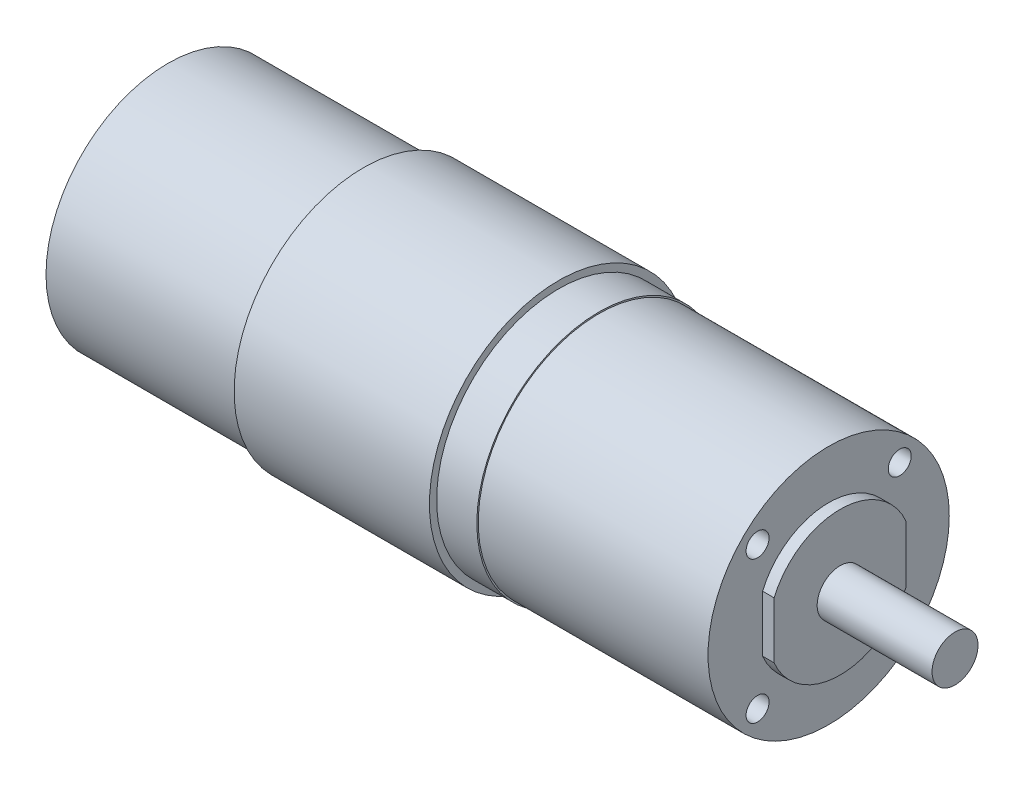
ISO-10303-21;
HEADER;
FILE_DESCRIPTION(('STEP AP214'),'2;1');
FILE_NAME('part.step','',(''),(''),'','','');
FILE_SCHEMA(('AUTOMOTIVE_DESIGN { 1 0 10303 214 1 1 1 1 }'));
ENDSEC;
DATA;
#1=APPLICATION_CONTEXT('core data for automotive mechanical design processes');
#2=APPLICATION_PROTOCOL_DEFINITION('international standard','automotive_design',2000,#1);
#3=PRODUCT_CONTEXT('',#1,'mechanical');
#4=PRODUCT('Part','Part','',(#3));
#5=PRODUCT_RELATED_PRODUCT_CATEGORY('part','',(#4));
#6=PRODUCT_DEFINITION_FORMATION('','',#4);
#7=PRODUCT_DEFINITION_CONTEXT('part definition',#1,'design');
#8=PRODUCT_DEFINITION('design','',#6,#7);
#9=PRODUCT_DEFINITION_SHAPE('','',#8);
#10=(LENGTH_UNIT() NAMED_UNIT(*) SI_UNIT(.MILLI.,.METRE.));
#11=(NAMED_UNIT(*) PLANE_ANGLE_UNIT() SI_UNIT($,.RADIAN.));
#12=(NAMED_UNIT(*) SI_UNIT($,.STERADIAN.) SOLID_ANGLE_UNIT());
#13=UNCERTAINTY_MEASURE_WITH_UNIT(LENGTH_MEASURE(1.E-05),#10,'distance_accuracy_value','');
#14=(GEOMETRIC_REPRESENTATION_CONTEXT(3) GLOBAL_UNCERTAINTY_ASSIGNED_CONTEXT((#13)) GLOBAL_UNIT_ASSIGNED_CONTEXT((#10,
#11,#12)) REPRESENTATION_CONTEXT('',''));
#15=CARTESIAN_POINT('',(0.,0.,0.));
#16=DIRECTION('',(0.,0.,1.));
#17=DIRECTION('',(1.,0.,0.));
#18=AXIS2_PLACEMENT_3D('',#15,#16,#17);
#19=CARTESIAN_POINT('',(40.,0.,0.));
#20=DIRECTION('',(-1.,0.,0.));
#21=DIRECTION('',(0.,0.,1.));
#22=AXIS2_PLACEMENT_3D('',#19,#20,#21);
#23=CYLINDRICAL_SURFACE('',#22,21.);
#24=CARTESIAN_POINT('',(40.,0.,0.));
#25=DIRECTION('',(1.,0.,0.));
#26=DIRECTION('',(0.,0.,-1.));
#27=AXIS2_PLACEMENT_3D('',#24,#25,#26);
#28=CIRCLE('',#27,21.);
#29=CARTESIAN_POINT('',(40.,0.,-21.));
#30=VERTEX_POINT('',#29);
#31=EDGE_CURVE('E92',#30,#30,#28,.T.);
#32=ORIENTED_EDGE('',*,*,#31,.F.);
#33=EDGE_LOOP('',(#32));
#34=FACE_BOUND('',#33,.T.);
#35=CARTESIAN_POINT('',(0.,0.,0.));
#36=DIRECTION('',(1.,0.,0.));
#37=DIRECTION('',(0.,0.,-1.));
#38=AXIS2_PLACEMENT_3D('',#35,#36,#37);
#39=CIRCLE('',#38,21.);
#40=CARTESIAN_POINT('',(0.,0.,-21.));
#41=VERTEX_POINT('',#40);
#42=EDGE_CURVE('E99',#41,#41,#39,.T.);
#43=ORIENTED_EDGE('',*,*,#42,.T.);
#44=EDGE_LOOP('',(#43));
#45=FACE_BOUND('',#44,.T.);
#46=ADVANCED_FACE('F32',(#34,#45),#23,.T.);
#47=CARTESIAN_POINT('',(40.,0.,0.));
#48=DIRECTION('',(1.,0.,0.));
#49=DIRECTION('',(0.,0.,-1.));
#50=AXIS2_PLACEMENT_3D('',#47,#48,#49);
#51=PLANE('',#50);
#52=CARTESIAN_POINT('',(40.,-12.3743686707645,12.374368670764));
#53=DIRECTION('',(1.,0.,0.));
#54=DIRECTION('',(0.,0.,-1.));
#55=AXIS2_PLACEMENT_3D('',#52,#53,#54);
#56=CIRCLE('',#55,2.00000000000037);
#57=CARTESIAN_POINT('',(40.,-12.3743686707645,10.3743686707636));
#58=VERTEX_POINT('',#57);
#59=EDGE_CURVE('E101',#58,#58,#56,.T.);
#60=ORIENTED_EDGE('',*,*,#59,.F.);
#61=EDGE_LOOP('',(#60));
#62=FACE_BOUND('',#61,.T.);
#63=CARTESIAN_POINT('',(40.,-12.3743686707639,-12.3743686707652));
#64=DIRECTION('',(1.,0.,0.));
#65=DIRECTION('',(0.,0.,-1.));
#66=AXIS2_PLACEMENT_3D('',#63,#64,#65);
#67=CIRCLE('',#66,2.00000000000097);
#68=CARTESIAN_POINT('',(40.,-12.3743686707639,-14.3743686707662));
#69=VERTEX_POINT('',#68);
#70=EDGE_CURVE('E130',#69,#69,#67,.T.);
#71=ORIENTED_EDGE('',*,*,#70,.F.);
#72=EDGE_LOOP('',(#71));
#73=FACE_BOUND('',#72,.T.);
#74=CARTESIAN_POINT('',(40.,12.3743686707652,-12.3743686707646));
#75=DIRECTION('',(1.,0.,0.));
#76=DIRECTION('',(0.,0.,-1.));
#77=AXIS2_PLACEMENT_3D('',#74,#75,#76);
#78=CIRCLE('',#77,2.00000000000072);
#79=CARTESIAN_POINT('',(40.,12.3743686707652,-14.3743686707654));
#80=VERTEX_POINT('',#79);
#81=EDGE_CURVE('E124',#80,#80,#78,.T.);
#82=ORIENTED_EDGE('',*,*,#81,.F.);
#83=EDGE_LOOP('',(#82));
#84=FACE_BOUND('',#83,.T.);
#85=CARTESIAN_POINT('',(40.,12.3743686707646,12.3743686707645));
#86=DIRECTION('',(1.,0.,0.));
#87=DIRECTION('',(0.,0.,-1.));
#88=AXIS2_PLACEMENT_3D('',#85,#86,#87);
#89=CIRCLE('',#88,2.);
#90=CARTESIAN_POINT('',(40.,12.3743686707646,10.3743686707645));
#91=VERTEX_POINT('',#90);
#92=EDGE_CURVE('E123',#91,#91,#89,.T.);
#93=ORIENTED_EDGE('',*,*,#92,.F.);
#94=EDGE_LOOP('',(#93));
#95=FACE_BOUND('',#94,.T.);
#96=CARTESIAN_POINT('',(40.,0.,0.));
#97=DIRECTION('',(1.,0.,0.));
#98=DIRECTION('',(0.,0.,-1.));
#99=AXIS2_PLACEMENT_3D('',#96,#97,#98);
#100=CIRCLE('',#99,12.5);
#101=CARTESIAN_POINT('',(40.,4.89897948556636,-11.5));
#102=VERTEX_POINT('',#101);
#103=CARTESIAN_POINT('',(40.,4.89897948556636,11.5));
#104=VERTEX_POINT('',#103);
#105=EDGE_CURVE('E46',#102,#104,#100,.T.);
#106=ORIENTED_EDGE('',*,*,#105,.F.);
#107=DIRECTION('',(0.,1.,0.));
#108=VECTOR('',#107,1.);
#109=CARTESIAN_POINT('',(40.,4.89897948556636,-11.5));
#110=LINE('',#109,#108);
#111=CARTESIAN_POINT('',(40.,-4.89897948556636,-11.5));
#112=VERTEX_POINT('',#111);
#113=EDGE_CURVE('E50',#112,#102,#110,.T.);
#114=ORIENTED_EDGE('',*,*,#113,.F.);
#115=CARTESIAN_POINT('',(40.,0.,0.));
#116=DIRECTION('',(1.,0.,0.));
#117=DIRECTION('',(0.,0.,-1.));
#118=AXIS2_PLACEMENT_3D('',#115,#116,#117);
#119=CIRCLE('',#118,12.5);
#120=CARTESIAN_POINT('',(40.,-4.89897948556636,11.5));
#121=VERTEX_POINT('',#120);
#122=EDGE_CURVE('E151',#121,#112,#119,.T.);
#123=ORIENTED_EDGE('',*,*,#122,.F.);
#124=DIRECTION('',(0.,-1.,0.));
#125=VECTOR('',#124,1.);
#126=CARTESIAN_POINT('',(40.,4.89897948556636,11.5));
#127=LINE('',#126,#125);
#128=EDGE_CURVE('E149',#104,#121,#127,.T.);
#129=ORIENTED_EDGE('',*,*,#128,.F.);
#130=EDGE_LOOP('',(#106,#114,#123,#129));
#131=FACE_BOUND('',#130,.T.);
#132=ORIENTED_EDGE('',*,*,#31,.T.);
#133=EDGE_LOOP('',(#132));
#134=FACE_BOUND('',#133,.T.);
#135=ADVANCED_FACE('F160',(#62,#73,#84,#95,#131,#134),#51,.T.);
#136=CARTESIAN_POINT('',(42.,0.,0.));
#137=DIRECTION('',(-1.,0.,0.));
#138=DIRECTION('',(0.,0.,1.));
#139=AXIS2_PLACEMENT_3D('',#136,#137,#138);
#140=CYLINDRICAL_SURFACE('',#139,12.5);
#141=ORIENTED_EDGE('',*,*,#105,.T.);
#142=DIRECTION('',(-1.,0.,0.));
#143=VECTOR('',#142,1.);
#144=CARTESIAN_POINT('',(42.,4.89897948556636,11.5));
#145=LINE('',#144,#143);
#146=CARTESIAN_POINT('',(42.,4.89897948556636,11.5));
#147=VERTEX_POINT('',#146);
#148=EDGE_CURVE('E75',#147,#104,#145,.T.);
#149=ORIENTED_EDGE('',*,*,#148,.F.);
#150=CARTESIAN_POINT('',(42.,0.,0.));
#151=DIRECTION('',(1.,0.,0.));
#152=DIRECTION('',(0.,0.,-1.));
#153=AXIS2_PLACEMENT_3D('',#150,#151,#152);
#154=CIRCLE('',#153,12.5);
#155=CARTESIAN_POINT('',(42.,4.89897948556636,-11.5));
#156=VERTEX_POINT('',#155);
#157=EDGE_CURVE('E81',#156,#147,#154,.T.);
#158=ORIENTED_EDGE('',*,*,#157,.F.);
#159=DIRECTION('',(-1.,0.,0.));
#160=VECTOR('',#159,1.);
#161=CARTESIAN_POINT('',(42.,4.89897948556636,-11.5));
#162=LINE('',#161,#160);
#163=EDGE_CURVE('E147',#156,#102,#162,.T.);
#164=ORIENTED_EDGE('',*,*,#163,.T.);
#165=EDGE_LOOP('',(#141,#149,#158,#164));
#166=FACE_BOUND('',#165,.T.);
#167=ADVANCED_FACE('F91',(#166),#140,.T.);
#168=CARTESIAN_POINT('',(42.,4.89897948556636,11.5));
#169=DIRECTION('',(0.,0.,-1.));
#170=DIRECTION('',(-1.,0.,0.));
#171=AXIS2_PLACEMENT_3D('',#168,#169,#170);
#172=PLANE('',#171);
#173=ORIENTED_EDGE('',*,*,#128,.T.);
#174=DIRECTION('',(-1.,0.,0.));
#175=VECTOR('',#174,1.);
#176=CARTESIAN_POINT('',(42.,-4.89897948556636,11.5));
#177=LINE('',#176,#175);
#178=CARTESIAN_POINT('',(42.,-4.89897948556636,11.5));
#179=VERTEX_POINT('',#178);
#180=EDGE_CURVE('E77',#179,#121,#177,.T.);
#181=ORIENTED_EDGE('',*,*,#180,.F.);
#182=DIRECTION('',(0.,-1.,0.));
#183=VECTOR('',#182,1.);
#184=CARTESIAN_POINT('',(42.,4.89897948556636,11.5));
#185=LINE('',#184,#183);
#186=EDGE_CURVE('E70',#147,#179,#185,.T.);
#187=ORIENTED_EDGE('',*,*,#186,.F.);
#188=ORIENTED_EDGE('',*,*,#148,.T.);
#189=EDGE_LOOP('',(#173,#181,#187,#188));
#190=FACE_BOUND('',#189,.T.);
#191=ADVANCED_FACE('F73',(#190),#172,.F.);
#192=CARTESIAN_POINT('',(42.,0.,0.));
#193=DIRECTION('',(-1.,0.,0.));
#194=DIRECTION('',(0.,0.,1.));
#195=AXIS2_PLACEMENT_3D('',#192,#193,#194);
#196=CYLINDRICAL_SURFACE('',#195,12.5);
#197=ORIENTED_EDGE('',*,*,#122,.T.);
#198=DIRECTION('',(-1.,0.,0.));
#199=VECTOR('',#198,1.);
#200=CARTESIAN_POINT('',(42.,-4.89897948556636,-11.5));
#201=LINE('',#200,#199);
#202=CARTESIAN_POINT('',(42.,-4.89897948556636,-11.5));
#203=VERTEX_POINT('',#202);
#204=EDGE_CURVE('E96',#203,#112,#201,.T.);
#205=ORIENTED_EDGE('',*,*,#204,.F.);
#206=CARTESIAN_POINT('',(42.,0.,0.));
#207=DIRECTION('',(1.,0.,0.));
#208=DIRECTION('',(0.,0.,-1.));
#209=AXIS2_PLACEMENT_3D('',#206,#207,#208);
#210=CIRCLE('',#209,12.5);
#211=EDGE_CURVE('E80',#179,#203,#210,.T.);
#212=ORIENTED_EDGE('',*,*,#211,.F.);
#213=ORIENTED_EDGE('',*,*,#180,.T.);
#214=EDGE_LOOP('',(#197,#205,#212,#213));
#215=FACE_BOUND('',#214,.T.);
#216=ADVANCED_FACE('F159',(#215),#196,.T.);
#217=CARTESIAN_POINT('',(42.,4.89897948556636,-11.5));
#218=DIRECTION('',(0.,0.,1.));
#219=DIRECTION('',(1.,0.,0.));
#220=AXIS2_PLACEMENT_3D('',#217,#218,#219);
#221=PLANE('',#220);
#222=ORIENTED_EDGE('',*,*,#113,.T.);
#223=ORIENTED_EDGE('',*,*,#163,.F.);
#224=DIRECTION('',(0.,1.,0.));
#225=VECTOR('',#224,1.);
#226=CARTESIAN_POINT('',(42.,4.89897948556636,-11.5));
#227=LINE('',#226,#225);
#228=EDGE_CURVE('E86',#203,#156,#227,.T.);
#229=ORIENTED_EDGE('',*,*,#228,.F.);
#230=ORIENTED_EDGE('',*,*,#204,.T.);
#231=EDGE_LOOP('',(#222,#223,#229,#230));
#232=FACE_BOUND('',#231,.T.);
#233=ADVANCED_FACE('F157',(#232),#221,.F.);
#234=CARTESIAN_POINT('',(42.,0.,0.));
#235=DIRECTION('',(1.,0.,0.));
#236=DIRECTION('',(0.,0.,-1.));
#237=AXIS2_PLACEMENT_3D('',#234,#235,#236);
#238=PLANE('',#237);
#239=CARTESIAN_POINT('',(42.,0.,0.));
#240=DIRECTION('',(1.,0.,0.));
#241=DIRECTION('',(0.,0.,-1.));
#242=AXIS2_PLACEMENT_3D('',#239,#240,#241);
#243=CIRCLE('',#242,4.);
#244=CARTESIAN_POINT('',(42.,0.,-4.));
#245=VERTEX_POINT('',#244);
#246=EDGE_CURVE('E39',#245,#245,#243,.T.);
#247=ORIENTED_EDGE('',*,*,#246,.F.);
#248=EDGE_LOOP('',(#247));
#249=FACE_BOUND('',#248,.T.);
#250=ORIENTED_EDGE('',*,*,#157,.T.);
#251=ORIENTED_EDGE('',*,*,#186,.T.);
#252=ORIENTED_EDGE('',*,*,#211,.T.);
#253=ORIENTED_EDGE('',*,*,#228,.T.);
#254=EDGE_LOOP('',(#250,#251,#252,#253));
#255=FACE_BOUND('',#254,.T.);
#256=ADVANCED_FACE('F84',(#249,#255),#238,.T.);
#257=CARTESIAN_POINT('',(62.,0.,0.));
#258=DIRECTION('',(-1.,0.,0.));
#259=DIRECTION('',(0.,0.,1.));
#260=AXIS2_PLACEMENT_3D('',#257,#258,#259);
#261=CYLINDRICAL_SURFACE('',#260,4.);
#262=CARTESIAN_POINT('',(62.,0.,0.));
#263=DIRECTION('',(1.,0.,0.));
#264=DIRECTION('',(0.,0.,-1.));
#265=AXIS2_PLACEMENT_3D('',#262,#263,#264);
#266=CIRCLE('',#265,4.);
#267=CARTESIAN_POINT('',(62.,0.,-4.));
#268=VERTEX_POINT('',#267);
#269=EDGE_CURVE('E138',#268,#268,#266,.T.);
#270=ORIENTED_EDGE('',*,*,#269,.F.);
#271=EDGE_LOOP('',(#270));
#272=FACE_BOUND('',#271,.T.);
#273=ORIENTED_EDGE('',*,*,#246,.T.);
#274=EDGE_LOOP('',(#273));
#275=FACE_BOUND('',#274,.T.);
#276=ADVANCED_FACE('F205',(#272,#275),#261,.T.);
#277=CARTESIAN_POINT('',(62.,0.,0.));
#278=DIRECTION('',(1.,0.,0.));
#279=DIRECTION('',(0.,0.,-1.));
#280=AXIS2_PLACEMENT_3D('',#277,#278,#279);
#281=PLANE('',#280);
#282=ORIENTED_EDGE('',*,*,#269,.T.);
#283=EDGE_LOOP('',(#282));
#284=FACE_BOUND('',#283,.T.);
#285=ADVANCED_FACE('F213',(#284),#281,.T.);
#286=CARTESIAN_POINT('',(30.,12.3743686707646,12.3743686707645));
#287=DIRECTION('',(1.,0.,0.));
#288=DIRECTION('',(0.,0.,-1.));
#289=AXIS2_PLACEMENT_3D('',#286,#287,#288);
#290=CYLINDRICAL_SURFACE('',#289,2.);
#291=CARTESIAN_POINT('',(30.,12.3743686707646,12.3743686707645));
#292=DIRECTION('',(1.,0.,0.));
#293=DIRECTION('',(0.,0.,-1.));
#294=AXIS2_PLACEMENT_3D('',#291,#292,#293);
#295=CIRCLE('',#294,2.);
#296=CARTESIAN_POINT('',(30.,12.3743686707646,10.3743686707645));
#297=VERTEX_POINT('',#296);
#298=EDGE_CURVE('E135',#297,#297,#295,.T.);
#299=ORIENTED_EDGE('',*,*,#298,.F.);
#300=EDGE_LOOP('',(#299));
#301=FACE_BOUND('',#300,.T.);
#302=ORIENTED_EDGE('',*,*,#92,.T.);
#303=EDGE_LOOP('',(#302));
#304=FACE_BOUND('',#303,.T.);
#305=ADVANCED_FACE('F220',(#301,#304),#290,.F.);
#306=CARTESIAN_POINT('',(30.,12.3743686707646,12.3743686707645));
#307=DIRECTION('',(1.,0.,0.));
#308=DIRECTION('',(0.,0.,-1.));
#309=AXIS2_PLACEMENT_3D('',#306,#307,#308);
#310=PLANE('',#309);
#311=ORIENTED_EDGE('',*,*,#298,.T.);
#312=EDGE_LOOP('',(#311));
#313=FACE_BOUND('',#312,.T.);
#314=ADVANCED_FACE('F227',(#313),#310,.T.);
#315=CARTESIAN_POINT('',(30.,12.3743686707652,-12.3743686707646));
#316=DIRECTION('',(1.,0.,0.));
#317=DIRECTION('',(0.,0.,-1.));
#318=AXIS2_PLACEMENT_3D('',#315,#316,#317);
#319=CYLINDRICAL_SURFACE('',#318,2.00000000000072);
#320=CARTESIAN_POINT('',(30.,12.3743686707652,-12.3743686707646));
#321=DIRECTION('',(1.,0.,0.));
#322=DIRECTION('',(0.,0.,-1.));
#323=AXIS2_PLACEMENT_3D('',#320,#321,#322);
#324=CIRCLE('',#323,2.00000000000072);
#325=CARTESIAN_POINT('',(30.,12.3743686707652,-14.3743686707654));
#326=VERTEX_POINT('',#325);
#327=EDGE_CURVE('E120',#326,#326,#324,.T.);
#328=ORIENTED_EDGE('',*,*,#327,.F.);
#329=EDGE_LOOP('',(#328));
#330=FACE_BOUND('',#329,.T.);
#331=ORIENTED_EDGE('',*,*,#81,.T.);
#332=EDGE_LOOP('',(#331));
#333=FACE_BOUND('',#332,.T.);
#334=ADVANCED_FACE('F235',(#330,#333),#319,.F.);
#335=CARTESIAN_POINT('',(30.,12.3743686707652,-12.3743686707646));
#336=DIRECTION('',(1.,0.,0.));
#337=DIRECTION('',(0.,0.,-1.));
#338=AXIS2_PLACEMENT_3D('',#335,#336,#337);
#339=PLANE('',#338);
#340=ORIENTED_EDGE('',*,*,#327,.T.);
#341=EDGE_LOOP('',(#340));
#342=FACE_BOUND('',#341,.T.);
#343=ADVANCED_FACE('F243',(#342),#339,.T.);
#344=CARTESIAN_POINT('',(30.,-12.3743686707639,-12.3743686707652));
#345=DIRECTION('',(1.,0.,0.));
#346=DIRECTION('',(0.,0.,-1.));
#347=AXIS2_PLACEMENT_3D('',#344,#345,#346);
#348=CYLINDRICAL_SURFACE('',#347,2.00000000000097);
#349=CARTESIAN_POINT('',(30.,-12.3743686707639,-12.3743686707652));
#350=DIRECTION('',(1.,0.,0.));
#351=DIRECTION('',(0.,0.,-1.));
#352=AXIS2_PLACEMENT_3D('',#349,#350,#351);
#353=CIRCLE('',#352,2.00000000000097);
#354=CARTESIAN_POINT('',(30.,-12.3743686707639,-14.3743686707662));
#355=VERTEX_POINT('',#354);
#356=EDGE_CURVE('E127',#355,#355,#353,.T.);
#357=ORIENTED_EDGE('',*,*,#356,.F.);
#358=EDGE_LOOP('',(#357));
#359=FACE_BOUND('',#358,.T.);
#360=ORIENTED_EDGE('',*,*,#70,.T.);
#361=EDGE_LOOP('',(#360));
#362=FACE_BOUND('',#361,.T.);
#363=ADVANCED_FACE('F251',(#359,#362),#348,.F.);
#364=CARTESIAN_POINT('',(30.,-12.3743686707639,-12.3743686707652));
#365=DIRECTION('',(1.,0.,0.));
#366=DIRECTION('',(0.,0.,-1.));
#367=AXIS2_PLACEMENT_3D('',#364,#365,#366);
#368=PLANE('',#367);
#369=ORIENTED_EDGE('',*,*,#356,.T.);
#370=EDGE_LOOP('',(#369));
#371=FACE_BOUND('',#370,.T.);
#372=ADVANCED_FACE('F259',(#371),#368,.T.);
#373=CARTESIAN_POINT('',(30.,-12.3743686707645,12.374368670764));
#374=DIRECTION('',(1.,0.,0.));
#375=DIRECTION('',(0.,0.,-1.));
#376=AXIS2_PLACEMENT_3D('',#373,#374,#375);
#377=CYLINDRICAL_SURFACE('',#376,2.00000000000037);
#378=CARTESIAN_POINT('',(30.,-12.3743686707645,12.374368670764));
#379=DIRECTION('',(1.,0.,0.));
#380=DIRECTION('',(0.,0.,-1.));
#381=AXIS2_PLACEMENT_3D('',#378,#379,#380);
#382=CIRCLE('',#381,2.00000000000037);
#383=CARTESIAN_POINT('',(30.,-12.3743686707645,10.3743686707636));
#384=VERTEX_POINT('',#383);
#385=EDGE_CURVE('E106',#384,#384,#382,.T.);
#386=ORIENTED_EDGE('',*,*,#385,.F.);
#387=EDGE_LOOP('',(#386));
#388=FACE_BOUND('',#387,.T.);
#389=ORIENTED_EDGE('',*,*,#59,.T.);
#390=EDGE_LOOP('',(#389));
#391=FACE_BOUND('',#390,.T.);
#392=ADVANCED_FACE('F267',(#388,#391),#377,.F.);
#393=CARTESIAN_POINT('',(30.,-12.3743686707645,12.374368670764));
#394=DIRECTION('',(1.,0.,0.));
#395=DIRECTION('',(0.,0.,-1.));
#396=AXIS2_PLACEMENT_3D('',#393,#394,#395);
#397=PLANE('',#396);
#398=ORIENTED_EDGE('',*,*,#385,.T.);
#399=EDGE_LOOP('',(#398));
#400=FACE_BOUND('',#399,.T.);
#401=ADVANCED_FACE('F275',(#400),#397,.T.);
#402=CARTESIAN_POINT('',(-75.,0.,0.));
#403=DIRECTION('',(1.,0.,0.));
#404=DIRECTION('',(0.,0.,-1.));
#405=AXIS2_PLACEMENT_3D('',#402,#403,#404);
#406=CYLINDRICAL_SURFACE('',#405,21.25);
#407=CARTESIAN_POINT('',(-7.,0.,0.));
#408=DIRECTION('',(1.,0.,0.));
#409=DIRECTION('',(0.,0.,-1.));
#410=AXIS2_PLACEMENT_3D('',#407,#408,#409);
#411=CIRCLE('',#410,21.25);
#412=CARTESIAN_POINT('',(-7.,0.,-21.25));
#413=VERTEX_POINT('',#412);
#414=EDGE_CURVE('E394',#413,#413,#411,.T.);
#415=ORIENTED_EDGE('',*,*,#414,.T.);
#416=EDGE_LOOP('',(#415));
#417=FACE_BOUND('',#416,.T.);
#418=CARTESIAN_POINT('',(0.,0.,0.));
#419=DIRECTION('',(-1.,0.,0.));
#420=DIRECTION('',(0.,0.,1.));
#421=AXIS2_PLACEMENT_3D('',#418,#419,#420);
#422=CIRCLE('',#421,21.25);
#423=CARTESIAN_POINT('',(0.,0.,21.25));
#424=VERTEX_POINT('',#423);
#425=EDGE_CURVE('E109',#424,#424,#422,.T.);
#426=ORIENTED_EDGE('',*,*,#425,.T.);
#427=EDGE_LOOP('',(#426));
#428=FACE_BOUND('',#427,.T.);
#429=ADVANCED_FACE('F283',(#417,#428),#406,.T.);
#430=CARTESIAN_POINT('',(0.,0.,0.));
#431=DIRECTION('',(-1.,0.,0.));
#432=DIRECTION('',(0.,0.,1.));
#433=AXIS2_PLACEMENT_3D('',#430,#431,#432);
#434=PLANE('',#433);
#435=ORIENTED_EDGE('',*,*,#42,.F.);
#436=EDGE_LOOP('',(#435));
#437=FACE_BOUND('',#436,.T.);
#438=ORIENTED_EDGE('',*,*,#425,.F.);
#439=EDGE_LOOP('',(#438));
#440=FACE_BOUND('',#439,.T.);
#441=ADVANCED_FACE('F292',(#437,#440),#434,.F.);
#442=CARTESIAN_POINT('',(-41.,0.,0.));
#443=DIRECTION('',(1.,0.,0.));
#444=DIRECTION('',(0.,0.,-1.));
#445=AXIS2_PLACEMENT_3D('',#442,#443,#444);
#446=CYLINDRICAL_SURFACE('',#445,22.5);
#447=CARTESIAN_POINT('',(-41.,0.,0.));
#448=DIRECTION('',(1.,0.,0.));
#449=DIRECTION('',(0.,0.,-1.));
#450=AXIS2_PLACEMENT_3D('',#447,#448,#449);
#451=CIRCLE('',#450,22.5);
#452=CARTESIAN_POINT('',(-41.,0.,-22.5));
#453=VERTEX_POINT('',#452);
#454=EDGE_CURVE('E114',#453,#453,#451,.T.);
#455=ORIENTED_EDGE('',*,*,#454,.T.);
#456=EDGE_LOOP('',(#455));
#457=FACE_BOUND('',#456,.T.);
#458=CARTESIAN_POINT('',(-7.,0.,0.));
#459=DIRECTION('',(1.,0.,0.));
#460=DIRECTION('',(0.,0.,-1.));
#461=AXIS2_PLACEMENT_3D('',#458,#459,#460);
#462=CIRCLE('',#461,22.5);
#463=CARTESIAN_POINT('',(-7.,0.,-22.5));
#464=VERTEX_POINT('',#463);
#465=EDGE_CURVE('E117',#464,#464,#462,.T.);
#466=ORIENTED_EDGE('',*,*,#465,.F.);
#467=EDGE_LOOP('',(#466));
#468=FACE_BOUND('',#467,.T.);
#469=ADVANCED_FACE('F302',(#457,#468),#446,.T.);
#470=CARTESIAN_POINT('',(-41.,0.,0.));
#471=DIRECTION('',(1.,0.,0.));
#472=DIRECTION('',(0.,0.,-1.));
#473=AXIS2_PLACEMENT_3D('',#470,#471,#472);
#474=PLANE('',#473);
#475=CARTESIAN_POINT('',(-41.,0.,0.));
#476=DIRECTION('',(1.,0.,0.));
#477=DIRECTION('',(0.,0.,-1.));
#478=AXIS2_PLACEMENT_3D('',#475,#476,#477);
#479=CIRCLE('',#478,21.25);
#480=CARTESIAN_POINT('',(-41.,0.,-21.25));
#481=VERTEX_POINT('',#480);
#482=EDGE_CURVE('E11',#481,#481,#479,.T.);
#483=ORIENTED_EDGE('',*,*,#482,.T.);
#484=EDGE_LOOP('',(#483));
#485=FACE_BOUND('',#484,.T.);
#486=ORIENTED_EDGE('',*,*,#454,.F.);
#487=EDGE_LOOP('',(#486));
#488=FACE_BOUND('',#487,.T.);
#489=ADVANCED_FACE('F309',(#485,#488),#474,.F.);
#490=CARTESIAN_POINT('',(-7.,0.,0.));
#491=DIRECTION('',(1.,0.,0.));
#492=DIRECTION('',(0.,0.,-1.));
#493=AXIS2_PLACEMENT_3D('',#490,#491,#492);
#494=PLANE('',#493);
#495=ORIENTED_EDGE('',*,*,#414,.F.);
#496=EDGE_LOOP('',(#495));
#497=FACE_BOUND('',#496,.T.);
#498=ORIENTED_EDGE('',*,*,#465,.T.);
#499=EDGE_LOOP('',(#498));
#500=FACE_BOUND('',#499,.T.);
#501=ADVANCED_FACE('F317',(#497,#500),#494,.T.);
#502=CARTESIAN_POINT('',(-75.,0.,0.));
#503=DIRECTION('',(-1.,0.,0.));
#504=DIRECTION('',(0.,0.,1.));
#505=AXIS2_PLACEMENT_3D('',#502,#503,#504);
#506=PLANE('',#505);
#507=CARTESIAN_POINT('',(-75.,0.,0.));
#508=DIRECTION('',(-1.,0.,0.));
#509=DIRECTION('',(0.,0.,1.));
#510=AXIS2_PLACEMENT_3D('',#507,#508,#509);
#511=CIRCLE('',#510,21.25);
#512=CARTESIAN_POINT('',(-75.,0.,21.25));
#513=VERTEX_POINT('',#512);
#514=EDGE_CURVE('E102',#513,#513,#511,.T.);
#515=ORIENTED_EDGE('',*,*,#514,.T.);
#516=EDGE_LOOP('',(#515));
#517=FACE_BOUND('',#516,.T.);
#518=ADVANCED_FACE('F325',(#517),#506,.T.);
#519=ORIENTED_EDGE('',*,*,#514,.F.);
#520=EDGE_LOOP('',(#519));
#521=FACE_BOUND('',#520,.T.);
#522=ORIENTED_EDGE('',*,*,#482,.F.);
#523=EDGE_LOOP('',(#522));
#524=FACE_BOUND('',#523,.T.);
#525=ADVANCED_FACE('F295',(#521,#524),#406,.T.);
#526=CLOSED_SHELL('',(#46,#135,#167,#191,#216,#233,#256,#276,#285,#305,#314,#334,#343,#363,#372,
#392,#401,#429,#441,#469,#489,#501,#518,#525));
#527=MANIFOLD_SOLID_BREP('B2',#526);
#528=ADVANCED_BREP_SHAPE_REPRESENTATION('',(#18,#527),#14);
#529=SHAPE_DEFINITION_REPRESENTATION(#9,#528);
ENDSEC;
END-ISO-10303-21;
